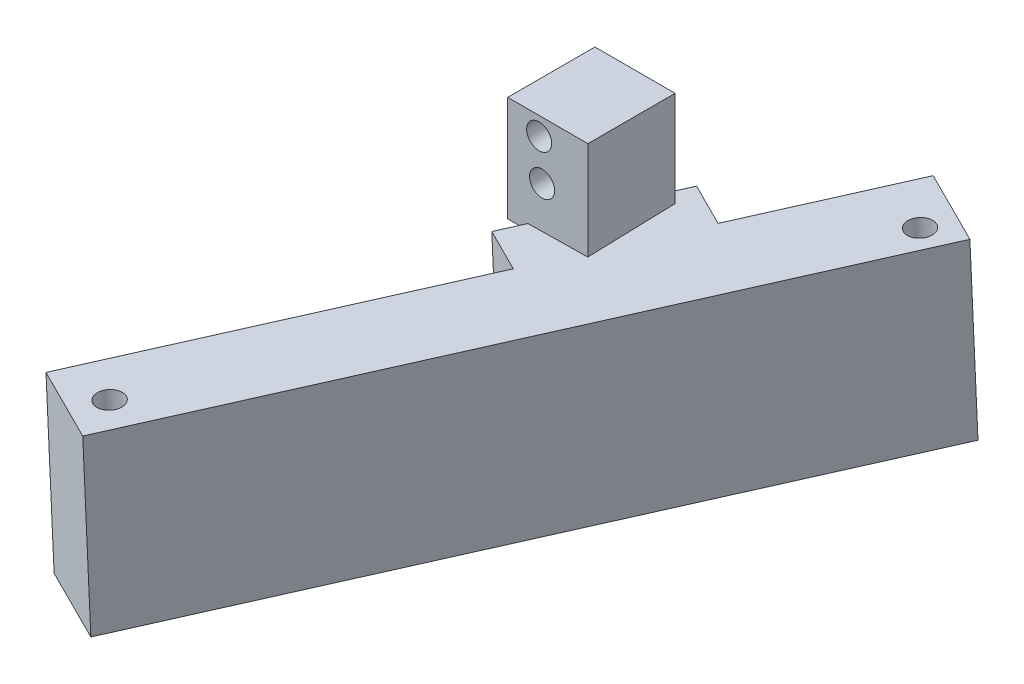
ISO-10303-21;
HEADER;
FILE_DESCRIPTION(('STEP AP214'),'2;1');
FILE_NAME('part.step','',(''),(''),'','','');
FILE_SCHEMA(('AUTOMOTIVE_DESIGN { 1 0 10303 214 1 1 1 1 }'));
ENDSEC;
DATA;
#1=APPLICATION_CONTEXT('core data for automotive mechanical design processes');
#2=APPLICATION_PROTOCOL_DEFINITION('international standard','automotive_design',2000,#1);
#3=PRODUCT_CONTEXT('',#1,'mechanical');
#4=PRODUCT('Part','Part','',(#3));
#5=PRODUCT_RELATED_PRODUCT_CATEGORY('part','',(#4));
#6=PRODUCT_DEFINITION_FORMATION('','',#4);
#7=PRODUCT_DEFINITION_CONTEXT('part definition',#1,'design');
#8=PRODUCT_DEFINITION('design','',#6,#7);
#9=PRODUCT_DEFINITION_SHAPE('','',#8);
#10=(LENGTH_UNIT() NAMED_UNIT(*) SI_UNIT(.MILLI.,.METRE.));
#11=(NAMED_UNIT(*) PLANE_ANGLE_UNIT() SI_UNIT($,.RADIAN.));
#12=(NAMED_UNIT(*) SI_UNIT($,.STERADIAN.) SOLID_ANGLE_UNIT());
#13=UNCERTAINTY_MEASURE_WITH_UNIT(LENGTH_MEASURE(1.E-05),#10,'distance_accuracy_value','');
#14=(GEOMETRIC_REPRESENTATION_CONTEXT(3) GLOBAL_UNCERTAINTY_ASSIGNED_CONTEXT((#13)) GLOBAL_UNIT_ASSIGNED_CONTEXT((#10,
#11,#12)) REPRESENTATION_CONTEXT('',''));
#15=CARTESIAN_POINT('',(0.,0.,0.));
#16=DIRECTION('',(0.,0.,1.));
#17=DIRECTION('',(1.,0.,0.));
#18=AXIS2_PLACEMENT_3D('',#15,#16,#17);
#19=CARTESIAN_POINT('',(-174.016953244847,212.848814703758,-54.6258711261587));
#20=DIRECTION('',(-1.,0.,0.));
#21=DIRECTION('',(0.,-1.,0.));
#22=AXIS2_PLACEMENT_3D('',#19,#20,#21);
#23=PLANE('',#22);
#24=DIRECTION('',(0.,0.0303994474954899,-0.999537829995428));
#25=VECTOR('',#24,1.);
#26=CARTESIAN_POINT('',(-174.016953244847,213.183117490544,6.48364553356453));
#27=LINE('',#26,#25);
#28=CARTESIAN_POINT('',(-174.016953244847,213.380307867998,0.));
#29=VERTEX_POINT('',#28);
#30=CARTESIAN_POINT('',(-174.016953244847,214.052385472863,-22.0979999999997));
#31=VERTEX_POINT('',#30);
#32=EDGE_CURVE('E254',#29,#31,#27,.T.);
#33=ORIENTED_EDGE('',*,*,#32,.T.);
#34=DIRECTION('',(0.,-1.,0.));
#35=VECTOR('',#34,1.);
#36=CARTESIAN_POINT('',(-174.016953244847,212.848814703758,-22.0979999999997));
#37=LINE('',#36,#35);
#38=CARTESIAN_POINT('',(-174.016953244847,238.248814703758,-22.0979999999997));
#39=VERTEX_POINT('',#38);
#40=EDGE_CURVE('E393',#39,#31,#37,.T.);
#41=ORIENTED_EDGE('',*,*,#40,.F.);
#42=DIRECTION('',(0.,0.,1.));
#43=VECTOR('',#42,1.);
#44=CARTESIAN_POINT('',(-174.016953244847,238.248814703758,-54.6258711261587));
#45=LINE('',#44,#43);
#46=CARTESIAN_POINT('',(-174.016953244847,238.248814703758,0.));
#47=VERTEX_POINT('',#46);
#48=EDGE_CURVE('E403',#39,#47,#45,.T.);
#49=ORIENTED_EDGE('',*,*,#48,.T.);
#50=DIRECTION('',(0.,1.,0.));
#51=VECTOR('',#50,1.);
#52=CARTESIAN_POINT('',(-174.016953244847,212.848814703758,0.));
#53=LINE('',#52,#51);
#54=EDGE_CURVE('E389',#29,#47,#53,.T.);
#55=ORIENTED_EDGE('',*,*,#54,.F.);
#56=EDGE_LOOP('',(#33,#41,#49,#55));
#57=FACE_BOUND('',#56,.T.);
#58=ADVANCED_FACE('F125',(#57),#23,.F.);
#59=CARTESIAN_POINT('',(0.,0.,0.));
#60=DIRECTION('',(0.,0.,-1.));
#61=DIRECTION('',(1.,0.,0.));
#62=AXIS2_PLACEMENT_3D('',#59,#60,#61);
#63=PLANE('',#62);
#64=CARTESIAN_POINT('',(-185.628460018152,223.67720196977,0.));
#65=DIRECTION('',(0.,0.,1.));
#66=DIRECTION('',(1.,0.,0.));
#67=AXIS2_PLACEMENT_3D('',#64,#65,#66);
#68=CIRCLE('',#67,3.175);
#69=CARTESIAN_POINT('',(-182.453460018152,223.67720196977,0.));
#70=VERTEX_POINT('',#69);
#71=EDGE_CURVE('E407',#70,#70,#68,.T.);
#72=ORIENTED_EDGE('',*,*,#71,.F.);
#73=EDGE_LOOP('',(#72));
#74=FACE_BOUND('',#73,.T.);
#75=CARTESIAN_POINT('',(-186.372442080017,233.67720196977,0.));
#76=DIRECTION('',(0.,0.,1.));
#77=DIRECTION('',(1.,0.,0.));
#78=AXIS2_PLACEMENT_3D('',#75,#76,#77);
#79=CIRCLE('',#78,3.17500000000006);
#80=CARTESIAN_POINT('',(-183.197442080017,233.67720196977,0.));
#81=VERTEX_POINT('',#80);
#82=EDGE_CURVE('E388',#81,#81,#79,.T.);
#83=ORIENTED_EDGE('',*,*,#82,.F.);
#84=EDGE_LOOP('',(#83));
#85=FACE_BOUND('',#84,.T.);
#86=DIRECTION('',(-0.0157631300254411,0.999875754147385,0.));
#87=VECTOR('',#86,1.);
#88=CARTESIAN_POINT('',(-173.330235036471,168.953350496691,0.));
#89=LINE('',#88,#87);
#90=CARTESIAN_POINT('',(-174.016953244847,212.512775901325,0.));
#91=VERTEX_POINT('',#90);
#92=CARTESIAN_POINT('',(-174.030626561832,213.380092107552,0.));
#93=VERTEX_POINT('',#92);
#94=EDGE_CURVE('E259',#91,#93,#89,.T.);
#95=ORIENTED_EDGE('',*,*,#94,.T.);
#96=DIRECTION('',(0.999875524233858,0.0157777069965299,0.));
#97=VECTOR('',#96,1.);
#98=CARTESIAN_POINT('',(-3.40955200068403,216.07243656105,0.));
#99=LINE('',#98,#97);
#100=EDGE_CURVE('E248',#93,#29,#99,.T.);
#101=ORIENTED_EDGE('',*,*,#100,.T.);
#102=ORIENTED_EDGE('',*,*,#54,.T.);
#103=DIRECTION('',(-1.,0.,0.));
#104=VECTOR('',#103,1.);
#105=CARTESIAN_POINT('',(-174.016953244847,238.248814703758,0.));
#106=LINE('',#105,#104);
#107=CARTESIAN_POINT('',(-194.336953244847,238.248814703758,0.));
#108=VERTEX_POINT('',#107);
#109=EDGE_CURVE('E398',#47,#108,#106,.T.);
#110=ORIENTED_EDGE('',*,*,#109,.T.);
#111=DIRECTION('',(0.,-1.,0.));
#112=VECTOR('',#111,1.);
#113=CARTESIAN_POINT('',(-194.336953244847,238.248814703758,0.));
#114=LINE('',#113,#112);
#115=CARTESIAN_POINT('',(-194.336953244847,211.578814703758,0.));
#116=VERTEX_POINT('',#115);
#117=EDGE_CURVE('E394',#108,#116,#114,.T.);
#118=ORIENTED_EDGE('',*,*,#117,.T.);
#119=DIRECTION('',(-1.,0.,0.));
#120=VECTOR('',#119,1.);
#121=CARTESIAN_POINT('',(-174.016953244847,211.578814703758,0.));
#122=LINE('',#121,#120);
#123=CARTESIAN_POINT('',(-189.188444901988,211.578814703758,0.));
#124=VERTEX_POINT('',#123);
#125=EDGE_CURVE('E302',#124,#116,#122,.T.);
#126=ORIENTED_EDGE('',*,*,#125,.F.);
#127=DIRECTION('',(0.000563474450897646,-0.999999841248259,0.));
#128=VECTOR('',#127,1.);
#129=CARTESIAN_POINT('',(-189.060877118614,-14.8161228482856,0.));
#130=LINE('',#129,#128);
#131=CARTESIAN_POINT('',(-189.188836265412,212.273368576049,5.48606299277665E-13));
#132=VERTEX_POINT('',#131);
#133=EDGE_CURVE('E144',#132,#124,#130,.T.);
#134=ORIENTED_EDGE('',*,*,#133,.F.);
#135=DIRECTION('',(0.999875524233858,0.0157777069965281,0.));
#136=VECTOR('',#135,1.);
#137=CARTESIAN_POINT('',(-3.39586603928595,215.205120554347,0.));
#138=LINE('',#137,#136);
#139=EDGE_CURVE('E134',#132,#91,#138,.T.);
#140=ORIENTED_EDGE('',*,*,#139,.T.);
#141=EDGE_LOOP('',(#95,#101,#102,#110,#118,#126,#134,#140));
#142=FACE_BOUND('',#141,.T.);
#143=ADVANCED_FACE('F271',(#74,#85,#142),#63,.F.);
#144=CARTESIAN_POINT('',(-216.877505131563,216.581396830597,-22.0979999999997));
#145=DIRECTION('',(0.,0.,1.));
#146=DIRECTION('',(-0.999875524233858,-0.0157777069965276,0.));
#147=AXIS2_PLACEMENT_3D('',#144,#145,#146);
#148=PLANE('',#147);
#149=CARTESIAN_POINT('',(-186.372442080017,233.67720196977,-22.0979999999997));
#150=DIRECTION('',(0.,0.,-1.));
#151=DIRECTION('',(0.,1.,0.));
#152=AXIS2_PLACEMENT_3D('',#149,#150,#151);
#153=CIRCLE('',#152,3.17500000000006);
#154=CARTESIAN_POINT('',(-186.372442080017,236.85220196977,-22.0979999999997));
#155=VERTEX_POINT('',#154);
#156=EDGE_CURVE('E424',#155,#155,#153,.T.);
#157=ORIENTED_EDGE('',*,*,#156,.F.);
#158=EDGE_LOOP('',(#157));
#159=FACE_BOUND('',#158,.T.);
#160=CARTESIAN_POINT('',(-185.628460018152,223.67720196977,-22.0979999999997));
#161=DIRECTION('',(0.,0.,-1.));
#162=DIRECTION('',(0.,1.,0.));
#163=AXIS2_PLACEMENT_3D('',#160,#161,#162);
#164=CIRCLE('',#163,3.175);
#165=CARTESIAN_POINT('',(-185.628460018152,226.85220196977,-22.0979999999997));
#166=VERTEX_POINT('',#165);
#167=EDGE_CURVE('E392',#166,#166,#164,.T.);
#168=ORIENTED_EDGE('',*,*,#167,.F.);
#169=EDGE_LOOP('',(#168));
#170=FACE_BOUND('',#169,.T.);
#171=DIRECTION('',(-0.999875524233858,-0.0157777069965299,0.));
#172=VECTOR('',#171,1.);
#173=CARTESIAN_POINT('',(-3.42015452429097,216.744346861578,-22.0979999999997));
#174=LINE('',#173,#172);
#175=CARTESIAN_POINT('',(-178.133939645701,213.987420781192,-22.0979999999997));
#176=VERTEX_POINT('',#175);
#177=EDGE_CURVE('E283',#31,#176,#174,.T.);
#178=ORIENTED_EDGE('',*,*,#177,.T.);
#179=DIRECTION('',(-0.000563474450897648,0.999999841248259,0.));
#180=VECTOR('',#179,1.);
#181=CARTESIAN_POINT('',(-178.135413585915,216.603227012823,-22.0979999999997));
#182=LINE('',#181,#180);
#183=CARTESIAN_POINT('',(-178.133298070165,212.848814703758,-22.0979999999997));
#184=VERTEX_POINT('',#183);
#185=EDGE_CURVE('E428',#184,#176,#182,.T.);
#186=ORIENTED_EDGE('',*,*,#185,.F.);
#187=DIRECTION('',(0.,1.,0.));
#188=VECTOR('',#187,1.);
#189=CARTESIAN_POINT('',(-178.133298070165,211.578814703758,-22.0979999999997));
#190=LINE('',#189,#188);
#191=CARTESIAN_POINT('',(-178.133298070165,211.578814703758,-22.0979999999997));
#192=VERTEX_POINT('',#191);
#193=EDGE_CURVE('E313',#192,#184,#190,.T.);
#194=ORIENTED_EDGE('',*,*,#193,.F.);
#195=DIRECTION('',(1.,0.,0.));
#196=VECTOR('',#195,1.);
#197=CARTESIAN_POINT('',(-194.336953244847,211.578814703758,-22.0979999999997));
#198=LINE('',#197,#196);
#199=CARTESIAN_POINT('',(-194.336953244847,211.578814703758,-22.0979999999997));
#200=VERTEX_POINT('',#199);
#201=EDGE_CURVE('E310',#200,#192,#198,.T.);
#202=ORIENTED_EDGE('',*,*,#201,.F.);
#203=DIRECTION('',(0.,1.,0.));
#204=VECTOR('',#203,1.);
#205=CARTESIAN_POINT('',(-194.336953244847,238.248814703758,-22.0979999999997));
#206=LINE('',#205,#204);
#207=CARTESIAN_POINT('',(-194.336953244847,238.248814703758,-22.0979999999997));
#208=VERTEX_POINT('',#207);
#209=EDGE_CURVE('E402',#200,#208,#206,.T.);
#210=ORIENTED_EDGE('',*,*,#209,.T.);
#211=DIRECTION('',(1.,0.,0.));
#212=VECTOR('',#211,1.);
#213=CARTESIAN_POINT('',(-174.016953244847,238.248814703758,-22.0979999999997));
#214=LINE('',#213,#212);
#215=EDGE_CURVE('E411',#208,#39,#214,.T.);
#216=ORIENTED_EDGE('',*,*,#215,.T.);
#217=ORIENTED_EDGE('',*,*,#40,.T.);
#218=EDGE_LOOP('',(#178,#186,#194,#202,#210,#216,#217));
#219=FACE_BOUND('',#218,.T.);
#220=ADVANCED_FACE('F127',(#159,#170,#219),#148,.F.);
#221=CARTESIAN_POINT('',(-171.33334940986,-14.8061338377583,-35.4330594880956));
#222=DIRECTION('',(-0.894315959358025,-0.000503924274127121,-0.447435705881706));
#223=DIRECTION('',(0.447435762692556,0.,-0.894316072909199));
#224=AXIS2_PLACEMENT_3D('',#221,#222,#223);
#225=PLANE('',#224);
#226=DIRECTION('',(0.447435762692556,0.,-0.894316072909199));
#227=VECTOR('',#226,1.);
#228=CARTESIAN_POINT('',(-171.435373779242,211.578814703758,-35.4841033560417));
#229=LINE('',#228,#227);
#230=CARTESIAN_POINT('',(-181.673124971977,211.578814703758,-15.0213102457833));
#231=VERTEX_POINT('',#230);
#232=EDGE_CURVE('E12',#124,#231,#229,.T.);
#233=ORIENTED_EDGE('',*,*,#232,.T.);
#234=DIRECTION('',(-0.00044735109258037,0.999999873002685,-0.000232102595376401));
#235=VECTOR('',#234,1.);
#236=CARTESIAN_POINT('',(-181.571851480918,-14.8059642271342,-14.9687657443667));
#237=LINE('',#236,#235);
#238=CARTESIAN_POINT('',(-181.673693107937,212.848814703758,-15.0216050161169));
#239=VERTEX_POINT('',#238);
#240=EDGE_CURVE('E323',#231,#239,#237,.T.);
#241=ORIENTED_EDGE('',*,*,#240,.T.);
#242=DIRECTION('',(0.447435762692556,0.,-0.894316072909199));
#243=VECTOR('',#242,1.);
#244=CARTESIAN_POINT('',(-168.361254858103,212.848814703758,-41.6299552847527));
#245=LINE('',#244,#243);
#246=EDGE_CURVE('E331',#239,#184,#245,.T.);
#247=ORIENTED_EDGE('',*,*,#246,.T.);
#248=ORIENTED_EDGE('',*,*,#185,.T.);
#249=DIRECTION('',(0.447157979679014,0.0342395776762373,-0.89379941403535));
#250=VECTOR('',#249,1.);
#251=CARTESIAN_POINT('',(-178.147124134856,213.986411224478,-22.0716462520701));
#252=LINE('',#251,#250);
#253=CARTESIAN_POINT('',(-174.947486578378,214.231412417858,-28.4672252265498));
#254=VERTEX_POINT('',#253);
#255=EDGE_CURVE('E287',#176,#254,#252,.T.);
#256=ORIENTED_EDGE('',*,*,#255,.T.);
#257=DIRECTION('',(-0.0157704168275924,0.999413526714982,0.0303956669972092));
#258=VECTOR('',#257,1.);
#259=CARTESIAN_POINT('',(-171.33334940986,-14.8061338377583,-35.4330594880956));
#260=LINE('',#259,#258);
#261=CARTESIAN_POINT('',(-174.246491550392,169.807481155377,-29.8183126245757));
#262=VERTEX_POINT('',#261);
#263=EDGE_CURVE('E340',#262,#254,#260,.T.);
#264=ORIENTED_EDGE('',*,*,#263,.F.);
#265=DIRECTION('',(0.447157979679015,0.0342395776762387,-0.893799414035349));
#266=VECTOR('',#265,1.);
#267=CARTESIAN_POINT('',(-174.246491550392,169.807481155377,-29.8183126245757));
#268=LINE('',#267,#266);
#269=CARTESIAN_POINT('',(-191.550880034104,168.482457381781,4.77047476122655));
#270=VERTEX_POINT('',#269);
#271=EDGE_CURVE('E365',#270,#262,#268,.T.);
#272=ORIENTED_EDGE('',*,*,#271,.F.);
#273=DIRECTION('',(-0.0157704168275924,0.999413526714982,0.0303956669972092));
#274=VECTOR('',#273,1.);
#275=CARTESIAN_POINT('',(-188.637737893573,-16.1311576113544,-0.844272102293387));
#276=LINE('',#275,#274);
#277=CARTESIAN_POINT('',(-192.251875062091,212.906388644262,6.1215621592525));
#278=VERTEX_POINT('',#277);
#279=EDGE_CURVE('E336',#270,#278,#276,.T.);
#280=ORIENTED_EDGE('',*,*,#279,.T.);
#281=DIRECTION('',(0.447157979679018,0.034239577676239,-0.893799414035348));
#282=VECTOR('',#281,1.);
#283=CARTESIAN_POINT('',(-192.251875062091,212.906388644262,6.1215621592525));
#284=LINE('',#283,#282);
#285=CARTESIAN_POINT('',(-189.202509582397,213.139883272447,0.0263537479295688));
#286=VERTEX_POINT('',#285);
#287=EDGE_CURVE('E461',#278,#286,#284,.T.);
#288=ORIENTED_EDGE('',*,*,#287,.T.);
#289=DIRECTION('',(-0.0157704168275923,0.999413526714982,0.0303956669972092));
#290=VECTOR('',#289,1.);
#291=CARTESIAN_POINT('',(-188.501483013577,168.713953182913,-1.32479444143038));
#292=LINE('',#291,#290);
#293=EDGE_CURVE('E273',#132,#286,#292,.T.);
#294=ORIENTED_EDGE('',*,*,#293,.F.);
#295=ORIENTED_EDGE('',*,*,#133,.T.);
#296=EDGE_LOOP('',(#233,#241,#247,#248,#256,#264,#272,#280,#288,#294,#295));
#297=FACE_BOUND('',#296,.T.);
#298=ADVANCED_FACE('F510',(#297),#225,.T.);
#299=CARTESIAN_POINT('',(-174.016953244847,238.248814703758,-54.6258711261587));
#300=DIRECTION('',(0.,-1.,0.));
#301=DIRECTION('',(0.,0.,1.));
#302=AXIS2_PLACEMENT_3D('',#299,#300,#301);
#303=PLANE('',#302);
#304=DIRECTION('',(0.,0.,1.));
#305=VECTOR('',#304,1.);
#306=CARTESIAN_POINT('',(-194.336953244847,238.248814703758,-54.6258711261587));
#307=LINE('',#306,#305);
#308=EDGE_CURVE('E397',#208,#108,#307,.T.);
#309=ORIENTED_EDGE('',*,*,#308,.T.);
#310=ORIENTED_EDGE('',*,*,#109,.F.);
#311=ORIENTED_EDGE('',*,*,#48,.F.);
#312=ORIENTED_EDGE('',*,*,#215,.F.);
#313=EDGE_LOOP('',(#309,#310,#311,#312));
#314=FACE_BOUND('',#313,.T.);
#315=ADVANCED_FACE('F506',(#314),#303,.F.);
#316=CARTESIAN_POINT('',(-194.336953244847,238.248814703758,-54.6258711261587));
#317=DIRECTION('',(1.,0.,0.));
#318=DIRECTION('',(0.,0.,1.));
#319=AXIS2_PLACEMENT_3D('',#316,#317,#318);
#320=PLANE('',#319);
#321=ORIENTED_EDGE('',*,*,#209,.F.);
#322=DIRECTION('',(0.,0.,-1.));
#323=VECTOR('',#322,1.);
#324=CARTESIAN_POINT('',(-194.336953244847,211.578814703758,0.));
#325=LINE('',#324,#323);
#326=EDGE_CURVE('E306',#116,#200,#325,.T.);
#327=ORIENTED_EDGE('',*,*,#326,.F.);
#328=ORIENTED_EDGE('',*,*,#117,.F.);
#329=ORIENTED_EDGE('',*,*,#308,.F.);
#330=EDGE_LOOP('',(#321,#327,#328,#329));
#331=FACE_BOUND('',#330,.T.);
#332=ADVANCED_FACE('F502',(#331),#320,.F.);
#333=CARTESIAN_POINT('',(-186.372442080017,233.67720196977,-54.6258711261587));
#334=DIRECTION('',(0.,0.,1.));
#335=DIRECTION('',(-1.,0.,0.));
#336=AXIS2_PLACEMENT_3D('',#333,#334,#335);
#337=CYLINDRICAL_SURFACE('',#336,3.17500000000006);
#338=ORIENTED_EDGE('',*,*,#156,.T.);
#339=EDGE_LOOP('',(#338));
#340=FACE_BOUND('',#339,.T.);
#341=ORIENTED_EDGE('',*,*,#82,.T.);
#342=EDGE_LOOP('',(#341));
#343=FACE_BOUND('',#342,.T.);
#344=ADVANCED_FACE('F505',(#340,#343),#337,.F.);
#345=CARTESIAN_POINT('',(-185.628460018152,223.67720196977,-54.6258711261587));
#346=DIRECTION('',(0.,0.,1.));
#347=DIRECTION('',(-1.,0.,0.));
#348=AXIS2_PLACEMENT_3D('',#345,#346,#347);
#349=CYLINDRICAL_SURFACE('',#348,3.175);
#350=ORIENTED_EDGE('',*,*,#167,.T.);
#351=EDGE_LOOP('',(#350));
#352=FACE_BOUND('',#351,.T.);
#353=ORIENTED_EDGE('',*,*,#71,.T.);
#354=EDGE_LOOP('',(#353));
#355=FACE_BOUND('',#354,.T.);
#356=ADVANCED_FACE('F513',(#352,#355),#349,.F.);
#357=CARTESIAN_POINT('',(-177.733197664702,-16.1250131805612,4.61138437298949));
#358=DIRECTION('',(-0.894315959358026,-0.00050392427412718,-0.447435705881705));
#359=DIRECTION('',(0.447435762692554,0.,-0.8943160729092));
#360=AXIS2_PLACEMENT_3D('',#357,#358,#359);
#361=PLANE('',#360);
#362=DIRECTION('',(-0.0157704168275924,0.999413526714982,0.0303956669972092));
#363=VECTOR('',#362,1.);
#364=CARTESIAN_POINT('',(-217.216804379115,-19.148333976506,83.5329873614397));
#365=LINE('',#364,#363);
#366=CARTESIAN_POINT('',(-220.129946519646,165.46528101663,89.1477342249596));
#367=VERTEX_POINT('',#366);
#368=CARTESIAN_POINT('',(-220.830941547632,209.889212279111,90.4988216229856));
#369=VERTEX_POINT('',#368);
#370=EDGE_CURVE('E348',#367,#369,#365,.T.);
#371=ORIENTED_EDGE('',*,*,#370,.T.);
#372=DIRECTION('',(0.447157979679013,0.034239577676239,-0.893799414035351));
#373=VECTOR('',#372,1.);
#374=CARTESIAN_POINT('',(-220.830941547632,209.889212279111,90.4988216229856));
#375=LINE('',#374,#373);
#376=CARTESIAN_POINT('',(-181.347334833219,212.912533075055,11.5772186345354));
#377=VERTEX_POINT('',#376);
#378=EDGE_CURVE('E453',#369,#377,#375,.T.);
#379=ORIENTED_EDGE('',*,*,#378,.T.);
#380=DIRECTION('',(-0.0157704168275924,0.999413526714982,0.0303956669972092));
#381=VECTOR('',#380,1.);
#382=CARTESIAN_POINT('',(-177.733197664702,-16.1250131805612,4.61138437298949));
#383=LINE('',#382,#381);
#384=CARTESIAN_POINT('',(-180.646339805233,168.488601812574,10.2261312365094));
#385=VERTEX_POINT('',#384);
#386=EDGE_CURVE('E344',#385,#377,#383,.T.);
#387=ORIENTED_EDGE('',*,*,#386,.F.);
#388=DIRECTION('',(0.447157979679014,0.0342395776762387,-0.89379941403535));
#389=VECTOR('',#388,1.);
#390=CARTESIAN_POINT('',(-180.646339805233,168.488601812574,10.2261312365094));
#391=LINE('',#390,#389);
#392=EDGE_CURVE('E326',#367,#385,#391,.T.);
#393=ORIENTED_EDGE('',*,*,#392,.F.);
#394=EDGE_LOOP('',(#371,#379,#387,#393));
#395=FACE_BOUND('',#394,.T.);
#396=ADVANCED_FACE('F516',(#395),#361,.T.);
#397=CARTESIAN_POINT('',(-217.216804379115,-19.148333976506,83.5329873614397));
#398=DIRECTION('',(-0.447157979679013,-0.0342395776762388,0.893799414035351));
#399=DIRECTION('',(-0.894323797431926,0.,-0.447420322903351));
#400=AXIS2_PLACEMENT_3D('',#397,#398,#399);
#401=PLANE('',#400);
#402=DIRECTION('',(-0.0157704168275924,0.999413526714982,0.0303956669972092));
#403=VECTOR('',#402,1.);
#404=CARTESIAN_POINT('',(-198.591031629984,-19.1378388277675,92.8516578943707));
#405=LINE('',#404,#403);
#406=CARTESIAN_POINT('',(-201.504173770515,165.475776165368,98.4664047578906));
#407=VERTEX_POINT('',#406);
#408=CARTESIAN_POINT('',(-202.205168798502,209.899707427849,99.8174921559166));
#409=VERTEX_POINT('',#408);
#410=EDGE_CURVE('E352',#407,#409,#405,.T.);
#411=ORIENTED_EDGE('',*,*,#410,.T.);
#412=DIRECTION('',(-0.894315959358027,-0.000503924274127552,-0.447435705881704));
#413=VECTOR('',#412,1.);
#414=CARTESIAN_POINT('',(-202.205168798502,209.899707427849,99.8174921559166));
#415=LINE('',#414,#413);
#416=EDGE_CURVE('E449',#409,#369,#415,.T.);
#417=ORIENTED_EDGE('',*,*,#416,.T.);
#418=ORIENTED_EDGE('',*,*,#370,.F.);
#419=DIRECTION('',(-0.894315959358027,-0.000503924274127118,-0.447435705881704));
#420=VECTOR('',#419,1.);
#421=CARTESIAN_POINT('',(-220.129946519646,165.46528101663,89.1477342249596));
#422=LINE('',#421,#420);
#423=EDGE_CURVE('E345',#407,#367,#422,.T.);
#424=ORIENTED_EDGE('',*,*,#423,.F.);
#425=EDGE_LOOP('',(#411,#417,#418,#424));
#426=FACE_BOUND('',#425,.T.);
#427=ADVANCED_FACE('F522',(#426),#401,.T.);
#428=CARTESIAN_POINT('',(-198.591031629984,-19.1378388277675,92.8516578943707));
#429=DIRECTION('',(0.894315959358026,0.000503924274127189,0.447435705881704));
#430=DIRECTION('',(-0.447435762692554,0.,0.8943160729092));
#431=AXIS2_PLACEMENT_3D('',#428,#429,#430);
#432=PLANE('',#431);
#433=DIRECTION('',(-0.0157704168275924,0.999413526714982,0.0303956669972092));
#434=VECTOR('',#433,1.);
#435=CARTESIAN_POINT('',(-123.629467916594,-13.3979160261228,-56.9848758745154));
#436=LINE('',#435,#434);
#437=CARTESIAN_POINT('',(-126.542610057125,171.215698967013,-51.3701290109955));
#438=VERTEX_POINT('',#437);
#439=CARTESIAN_POINT('',(-127.243605085112,215.639630229494,-50.0190416129695));
#440=VERTEX_POINT('',#439);
#441=EDGE_CURVE('E356',#438,#440,#436,.T.);
#442=ORIENTED_EDGE('',*,*,#441,.T.);
#443=DIRECTION('',(-0.447157979679013,-0.0342395776762386,0.89379941403535));
#444=VECTOR('',#443,1.);
#445=CARTESIAN_POINT('',(-127.243605085112,215.639630229494,-50.0190416129695));
#446=LINE('',#445,#444);
#447=EDGE_CURVE('E445',#440,#409,#446,.T.);
#448=ORIENTED_EDGE('',*,*,#447,.T.);
#449=ORIENTED_EDGE('',*,*,#410,.F.);
#450=DIRECTION('',(-0.447157979679014,-0.0342395776762387,0.89379941403535));
#451=VECTOR('',#450,1.);
#452=CARTESIAN_POINT('',(-201.504173770515,165.475776165368,98.4664047578906));
#453=LINE('',#452,#451);
#454=EDGE_CURVE('E349',#438,#407,#453,.T.);
#455=ORIENTED_EDGE('',*,*,#454,.F.);
#456=EDGE_LOOP('',(#442,#448,#449,#455));
#457=FACE_BOUND('',#456,.T.);
#458=ADVANCED_FACE('F576',(#457),#432,.T.);
#459=CARTESIAN_POINT('',(-123.629467916594,-13.3979160261228,-56.9848758745154));
#460=DIRECTION('',(0.447157979679014,0.0342395776762388,-0.89379941403535));
#461=DIRECTION('',(0.894323797431926,0.,0.447420322903353));
#462=AXIS2_PLACEMENT_3D('',#459,#460,#461);
#463=PLANE('',#462);
#464=DIRECTION('',(-0.0157704168275924,0.999413526714982,0.0303956669972092));
#465=VECTOR('',#464,1.);
#466=CARTESIAN_POINT('',(-142.256280718103,-13.4084117609043,-66.3040667566196));
#467=LINE('',#466,#465);
#468=CARTESIAN_POINT('',(-145.169422858634,171.205203232231,-60.6893198930996));
#469=VERTEX_POINT('',#468);
#470=CARTESIAN_POINT('',(-145.870417886621,215.629134494712,-59.3382324950737));
#471=VERTEX_POINT('',#470);
#472=EDGE_CURVE('E360',#469,#471,#467,.T.);
#473=ORIENTED_EDGE('',*,*,#472,.T.);
#474=DIRECTION('',(0.894315959358026,0.000503924274126784,0.447435705881704));
#475=VECTOR('',#474,1.);
#476=CARTESIAN_POINT('',(-145.870417886621,215.629134494712,-59.3382324950737));
#477=LINE('',#476,#475);
#478=EDGE_CURVE('E441',#471,#440,#477,.T.);
#479=ORIENTED_EDGE('',*,*,#478,.T.);
#480=ORIENTED_EDGE('',*,*,#441,.F.);
#481=DIRECTION('',(0.894315959358026,0.000503924274127069,0.447435705881705));
#482=VECTOR('',#481,1.);
#483=CARTESIAN_POINT('',(-126.542610057125,171.215698967013,-51.3701290109955));
#484=LINE('',#483,#482);
#485=EDGE_CURVE('E353',#469,#438,#484,.T.);
#486=ORIENTED_EDGE('',*,*,#485,.F.);
#487=EDGE_LOOP('',(#473,#479,#480,#486));
#488=FACE_BOUND('',#487,.T.);
#489=ADVANCED_FACE('F572',(#488),#463,.T.);
#490=CARTESIAN_POINT('',(-142.256280718103,-13.4084117609043,-66.3040667566196));
#491=DIRECTION('',(-0.894315959358026,-0.000503924274127185,-0.447435705881704));
#492=DIRECTION('',(0.447435762692554,0.,-0.8943160729092));
#493=AXIS2_PLACEMENT_3D('',#490,#491,#492);
#494=PLANE('',#493);
#495=DIRECTION('',(-0.0157704168275924,0.999413526714982,0.0303956669972092));
#496=VECTOR('',#495,1.);
#497=CARTESIAN_POINT('',(-160.429849233367,-14.7999899930082,-29.9779233619859));
#498=LINE('',#497,#496);
#499=CARTESIAN_POINT('',(-163.342991373899,169.813625000127,-24.363176498466));
#500=VERTEX_POINT('',#499);
#501=CARTESIAN_POINT('',(-164.043986401885,214.237556262608,-23.01208910044));
#502=VERTEX_POINT('',#501);
#503=EDGE_CURVE('E364',#500,#502,#498,.T.);
#504=ORIENTED_EDGE('',*,*,#503,.T.);
#505=DIRECTION('',(0.447157979679014,0.0342395776762385,-0.89379941403535));
#506=VECTOR('',#505,1.);
#507=CARTESIAN_POINT('',(-164.043986401885,214.237556262608,-23.01208910044));
#508=LINE('',#507,#506);
#509=EDGE_CURVE('E437',#502,#471,#508,.T.);
#510=ORIENTED_EDGE('',*,*,#509,.T.);
#511=ORIENTED_EDGE('',*,*,#472,.F.);
#512=DIRECTION('',(0.447157979679014,0.0342395776762387,-0.89379941403535));
#513=VECTOR('',#512,1.);
#514=CARTESIAN_POINT('',(-145.169422858634,171.205203232231,-60.6893198930996));
#515=LINE('',#514,#513);
#516=EDGE_CURVE('E357',#500,#469,#515,.T.);
#517=ORIENTED_EDGE('',*,*,#516,.F.);
#518=EDGE_LOOP('',(#504,#510,#511,#517));
#519=FACE_BOUND('',#518,.T.);
#520=ADVANCED_FACE('F568',(#519),#494,.T.);
#521=CARTESIAN_POINT('',(-160.429849233367,-14.7999899930082,-29.9779233619859));
#522=DIRECTION('',(0.447157979679013,0.0342395776762388,-0.893799414035351));
#523=DIRECTION('',(0.894323797431926,0.,0.447420322903351));
#524=AXIS2_PLACEMENT_3D('',#521,#522,#523);
#525=PLANE('',#524);
#526=ORIENTED_EDGE('',*,*,#263,.T.);
#527=DIRECTION('',(0.894315959358026,0.000503924274128339,0.447435705881704));
#528=VECTOR('',#527,1.);
#529=CARTESIAN_POINT('',(-174.947486578378,214.231412417858,-28.4672252265498));
#530=LINE('',#529,#528);
#531=EDGE_CURVE('E292',#254,#502,#530,.T.);
#532=ORIENTED_EDGE('',*,*,#531,.T.);
#533=ORIENTED_EDGE('',*,*,#503,.F.);
#534=DIRECTION('',(0.894315959358027,0.000503924274127121,0.447435705881704));
#535=VECTOR('',#534,1.);
#536=CARTESIAN_POINT('',(-163.342991373899,169.813625000127,-24.363176498466));
#537=LINE('',#536,#535);
#538=EDGE_CURVE('E361',#262,#500,#537,.T.);
#539=ORIENTED_EDGE('',*,*,#538,.F.);
#540=EDGE_LOOP('',(#526,#532,#533,#539));
#541=FACE_BOUND('',#540,.T.);
#542=ADVANCED_FACE('F487',(#541),#525,.T.);
#543=CARTESIAN_POINT('',(-188.637737893573,-16.1311576113544,-0.844272102293387));
#544=DIRECTION('',(-0.447157979679015,-0.0342395776762388,0.89379941403535));
#545=DIRECTION('',(-0.894323797431925,0.,-0.447420322903354));
#546=AXIS2_PLACEMENT_3D('',#543,#544,#545);
#547=PLANE('',#546);
#548=ORIENTED_EDGE('',*,*,#386,.T.);
#549=DIRECTION('',(-0.894315959358025,-0.000503924274127026,-0.447435705881708));
#550=VECTOR('',#549,1.);
#551=CARTESIAN_POINT('',(-181.347334833219,212.912533075055,11.5772186345354));
#552=LINE('',#551,#550);
#553=EDGE_CURVE('E457',#377,#278,#552,.T.);
#554=ORIENTED_EDGE('',*,*,#553,.T.);
#555=ORIENTED_EDGE('',*,*,#279,.F.);
#556=DIRECTION('',(-0.894315959358025,-0.000503924274127035,-0.447435705881706));
#557=VECTOR('',#556,1.);
#558=CARTESIAN_POINT('',(-191.550880034104,168.482457381781,4.77047476122656));
#559=LINE('',#558,#557);
#560=EDGE_CURVE('E337',#385,#270,#559,.T.);
#561=ORIENTED_EDGE('',*,*,#560,.F.);
#562=EDGE_LOOP('',(#548,#554,#555,#561));
#563=FACE_BOUND('',#562,.T.);
#564=ADVANCED_FACE('F477',(#563),#547,.T.);
#565=CARTESIAN_POINT('',(-132.709969529216,-13.6497621885126,-53.4154471819686));
#566=DIRECTION('',(-0.0157704168275924,0.999413526714982,0.0303956669972092));
#567=DIRECTION('',(0.,0.0303994474954896,-0.999537829995428));
#568=AXIS2_PLACEMENT_3D('',#565,#566,#567);
#569=CYLINDRICAL_SURFACE('',#568,3.17499999999999);
#570=CARTESIAN_POINT('',(-135.623111669747,170.963852804623,-47.8007003184487));
#571=DIRECTION('',(-0.0157704168275923,0.999413526714982,0.0303956669972092));
#572=DIRECTION('',(0.,-0.0303994474954895,0.999537829995428));
#573=AXIS2_PLACEMENT_3D('',#570,#571,#572);
#574=CIRCLE('',#573,3.17499999999999);
#575=CARTESIAN_POINT('',(-135.623111669747,170.867334558825,-44.6271677082132));
#576=VERTEX_POINT('',#575);
#577=EDGE_CURVE('E327',#576,#576,#574,.F.);
#578=ORIENTED_EDGE('',*,*,#577,.T.);
#579=EDGE_LOOP('',(#578));
#580=FACE_BOUND('',#579,.T.);
#581=CARTESIAN_POINT('',(-136.324106697734,215.387784067104,-46.4496129204228));
#582=DIRECTION('',(0.0157704168275923,-0.999413526714982,-0.0303956669972092));
#583=DIRECTION('',(0.,0.0303994474954895,-0.999537829995428));
#584=AXIS2_PLACEMENT_3D('',#581,#582,#583);
#585=CIRCLE('',#584,3.17500000000002);
#586=CARTESIAN_POINT('',(-136.324106697734,215.484302312902,-49.6231455306583));
#587=VERTEX_POINT('',#586);
#588=EDGE_CURVE('E278',#587,#587,#585,.T.);
#589=ORIENTED_EDGE('',*,*,#588,.F.);
#590=EDGE_LOOP('',(#589));
#591=FACE_BOUND('',#590,.T.);
#592=ADVANCED_FACE('F474',(#580,#591),#569,.F.);
#593=CARTESIAN_POINT('',(-202.855165444124,-18.86843893718,81.7813608537693));
#594=DIRECTION('',(-0.0157704168275924,0.999413526714982,0.0303956669972092));
#595=DIRECTION('',(0.,0.0303994474954896,-0.999537829995428));
#596=AXIS2_PLACEMENT_3D('',#593,#594,#595);
#597=CYLINDRICAL_SURFACE('',#596,3.17499999999999);
#598=CARTESIAN_POINT('',(-205.768307584655,165.745176055956,87.3961077172892));
#599=DIRECTION('',(-0.0157704168275923,0.999413526714982,0.0303956669972092));
#600=DIRECTION('',(0.,-0.0303994474954895,0.999537829995428));
#601=AXIS2_PLACEMENT_3D('',#598,#599,#600);
#602=CIRCLE('',#601,3.17499999999999);
#603=CARTESIAN_POINT('',(-205.768307584655,165.648657810157,90.5696403275247));
#604=VERTEX_POINT('',#603);
#605=EDGE_CURVE('E332',#604,#604,#602,.F.);
#606=ORIENTED_EDGE('',*,*,#605,.T.);
#607=EDGE_LOOP('',(#606));
#608=FACE_BOUND('',#607,.T.);
#609=CARTESIAN_POINT('',(-206.469302612642,210.169107318437,88.7471951153152));
#610=DIRECTION('',(0.0157704168275923,-0.999413526714982,-0.0303956669972092));
#611=DIRECTION('',(0.,0.0303994474954895,-0.999537829995428));
#612=AXIS2_PLACEMENT_3D('',#609,#610,#611);
#613=CIRCLE('',#612,3.17499999999999);
#614=CARTESIAN_POINT('',(-206.469302612642,210.265625564235,85.5736625050797));
#615=VERTEX_POINT('',#614);
#616=EDGE_CURVE('E268',#615,#615,#613,.T.);
#617=ORIENTED_EDGE('',*,*,#616,.F.);
#618=EDGE_LOOP('',(#617));
#619=FACE_BOUND('',#618,.T.);
#620=ADVANCED_FACE('F476',(#608,#619),#597,.F.);
#621=CARTESIAN_POINT('',(-135.623111669747,170.963852804623,-47.8007003184485));
#622=DIRECTION('',(0.0157704168275923,-0.999413526714982,-0.0303956669972092));
#623=DIRECTION('',(0.100164718838687,-0.0286674208627036,0.994557795244222));
#624=AXIS2_PLACEMENT_3D('',#621,#622,#623);
#625=PLANE('',#624);
#626=ORIENTED_EDGE('',*,*,#392,.T.);
#627=ORIENTED_EDGE('',*,*,#560,.T.);
#628=ORIENTED_EDGE('',*,*,#271,.T.);
#629=ORIENTED_EDGE('',*,*,#538,.T.);
#630=ORIENTED_EDGE('',*,*,#516,.T.);
#631=ORIENTED_EDGE('',*,*,#485,.T.);
#632=ORIENTED_EDGE('',*,*,#454,.T.);
#633=ORIENTED_EDGE('',*,*,#423,.T.);
#634=EDGE_LOOP('',(#626,#627,#628,#629,#630,#631,#632,#633));
#635=FACE_BOUND('',#634,.T.);
#636=ORIENTED_EDGE('',*,*,#605,.F.);
#637=EDGE_LOOP('',(#636));
#638=FACE_BOUND('',#637,.T.);
#639=ORIENTED_EDGE('',*,*,#577,.F.);
#640=EDGE_LOOP('',(#639));
#641=FACE_BOUND('',#640,.T.);
#642=ADVANCED_FACE('F484',(#635,#638,#641),#625,.T.);
#643=CARTESIAN_POINT('',(-178.133298070165,211.578814703758,-22.0979999999997));
#644=DIRECTION('',(-0.894316072909198,0.,-0.447435762692557));
#645=DIRECTION('',(-0.447435762692557,0.,0.894316072909198));
#646=AXIS2_PLACEMENT_3D('',#643,#644,#645);
#647=PLANE('',#646);
#648=ORIENTED_EDGE('',*,*,#246,.F.);
#649=DIRECTION('',(0.,1.,0.));
#650=VECTOR('',#649,1.);
#651=CARTESIAN_POINT('',(-181.673693107937,211.578814703758,-15.0216050161169));
#652=LINE('',#651,#650);
#653=CARTESIAN_POINT('',(-181.673693107937,211.578814703758,-15.0216050161169));
#654=VERTEX_POINT('',#653);
#655=EDGE_CURVE('E317',#654,#239,#652,.T.);
#656=ORIENTED_EDGE('',*,*,#655,.F.);
#657=DIRECTION('',(-0.447435762692557,0.,0.894316072909198));
#658=VECTOR('',#657,1.);
#659=CARTESIAN_POINT('',(-178.133298070165,211.578814703758,-22.0979999999997));
#660=LINE('',#659,#658);
#661=EDGE_CURVE('E291',#192,#654,#660,.T.);
#662=ORIENTED_EDGE('',*,*,#661,.F.);
#663=ORIENTED_EDGE('',*,*,#193,.T.);
#664=EDGE_LOOP('',(#648,#656,#662,#663));
#665=FACE_BOUND('',#664,.T.);
#666=ADVANCED_FACE('F554',(#665),#647,.F.);
#667=CARTESIAN_POINT('',(-181.673693107937,211.578814703758,-15.0216050161169));
#668=DIRECTION('',(-0.460540409048831,0.,0.887638739371562));
#669=DIRECTION('',(0.887638739371562,0.,0.460540409048831));
#670=AXIS2_PLACEMENT_3D('',#667,#668,#669);
#671=PLANE('',#670);
#672=ORIENTED_EDGE('',*,*,#240,.F.);
#673=DIRECTION('',(0.887638739371562,0.,0.460540409048831));
#674=VECTOR('',#673,1.);
#675=CARTESIAN_POINT('',(-181.673693107937,211.578814703758,-15.0216050161169));
#676=LINE('',#675,#674);
#677=EDGE_CURVE('E298',#654,#231,#676,.T.);
#678=ORIENTED_EDGE('',*,*,#677,.F.);
#679=ORIENTED_EDGE('',*,*,#655,.T.);
#680=EDGE_LOOP('',(#672,#678,#679));
#681=FACE_BOUND('',#680,.T.);
#682=ADVANCED_FACE('F551',(#681),#671,.F.);
#683=CARTESIAN_POINT('',(0.,211.578814703758,0.));
#684=DIRECTION('',(0.,1.,0.));
#685=DIRECTION('',(0.,0.,1.));
#686=AXIS2_PLACEMENT_3D('',#683,#684,#685);
#687=PLANE('',#686);
#688=ORIENTED_EDGE('',*,*,#232,.F.);
#689=ORIENTED_EDGE('',*,*,#125,.T.);
#690=ORIENTED_EDGE('',*,*,#326,.T.);
#691=ORIENTED_EDGE('',*,*,#201,.T.);
#692=ORIENTED_EDGE('',*,*,#661,.T.);
#693=ORIENTED_EDGE('',*,*,#677,.T.);
#694=EDGE_LOOP('',(#688,#689,#690,#691,#692,#693));
#695=FACE_BOUND('',#694,.T.);
#696=ADVANCED_FACE('F546',(#695),#687,.F.);
#697=CARTESIAN_POINT('',(-188.501483013577,168.713953182913,-1.32479444143038));
#698=DIRECTION('',(0.000479573927844767,-0.0303918834732723,0.99953794496647));
#699=DIRECTION('',(0.,-0.999538059908932,-0.0303918869682051));
#700=AXIS2_PLACEMENT_3D('',#697,#698,#699);
#701=PLANE('',#700);
#702=ORIENTED_EDGE('',*,*,#139,.F.);
#703=ORIENTED_EDGE('',*,*,#293,.T.);
#704=DIRECTION('',(0.999875524233858,0.0157777069965268,0.));
#705=VECTOR('',#704,1.);
#706=CARTESIAN_POINT('',(-189.202509582397,213.139883272447,0.0263537479295688));
#707=LINE('',#706,#705);
#708=CARTESIAN_POINT('',(-174.030626561832,213.379290597742,0.026353747929587));
#709=VERTEX_POINT('',#708);
#710=EDGE_CURVE('E267',#286,#709,#707,.T.);
#711=ORIENTED_EDGE('',*,*,#710,.T.);
#712=DIRECTION('',(-0.0157704168275923,0.999413526714982,0.0303956669972092));
#713=VECTOR('',#712,1.);
#714=CARTESIAN_POINT('',(-173.329599993012,168.953360508207,-1.32479444143036));
#715=LINE('',#714,#713);
#716=EDGE_CURVE('E264',#91,#709,#715,.T.);
#717=ORIENTED_EDGE('',*,*,#716,.F.);
#718=EDGE_LOOP('',(#702,#703,#711,#717));
#719=FACE_BOUND('',#718,.T.);
#720=ADVANCED_FACE('F608',(#719),#701,.F.);
#721=CARTESIAN_POINT('',(-173.329599993012,168.953360508207,-1.32479444143036));
#722=DIRECTION('',(0.999875639243743,0.015763128213975,0.000479411958331127));
#723=DIRECTION('',(-0.0157631300254411,0.999875754147385,0.));
#724=AXIS2_PLACEMENT_3D('',#721,#722,#723);
#725=PLANE('',#724);
#726=ORIENTED_EDGE('',*,*,#94,.F.);
#727=ORIENTED_EDGE('',*,*,#716,.T.);
#728=DIRECTION('',(0.,0.0303994474954899,-0.999537829995428));
#729=VECTOR('',#728,1.);
#730=CARTESIAN_POINT('',(-174.030626561832,213.379290597742,0.026353747929587));
#731=LINE('',#730,#729);
#732=EDGE_CURVE('E252',#709,#93,#731,.T.);
#733=ORIENTED_EDGE('',*,*,#732,.T.);
#734=EDGE_LOOP('',(#726,#727,#733));
#735=FACE_BOUND('',#734,.T.);
#736=ADVANCED_FACE('F262',(#735),#725,.F.);
#737=CARTESIAN_POINT('',(-3.40640192727784,215.872807977563,6.5654484451558));
#738=DIRECTION('',(0.0157704168275946,-0.999413526714983,-0.0303956669972096));
#739=DIRECTION('',(0.,0.0303994474954899,-0.999537829995428));
#740=AXIS2_PLACEMENT_3D('',#737,#738,#739);
#741=PLANE('',#740);
#742=ORIENTED_EDGE('',*,*,#616,.T.);
#743=EDGE_LOOP('',(#742));
#744=FACE_BOUND('',#743,.T.);
#745=ORIENTED_EDGE('',*,*,#588,.T.);
#746=EDGE_LOOP('',(#745));
#747=FACE_BOUND('',#746,.T.);
#748=ORIENTED_EDGE('',*,*,#100,.F.);
#749=ORIENTED_EDGE('',*,*,#732,.F.);
#750=ORIENTED_EDGE('',*,*,#710,.F.);
#751=ORIENTED_EDGE('',*,*,#287,.F.);
#752=ORIENTED_EDGE('',*,*,#553,.F.);
#753=ORIENTED_EDGE('',*,*,#378,.F.);
#754=ORIENTED_EDGE('',*,*,#416,.F.);
#755=ORIENTED_EDGE('',*,*,#447,.F.);
#756=ORIENTED_EDGE('',*,*,#478,.F.);
#757=ORIENTED_EDGE('',*,*,#509,.F.);
#758=ORIENTED_EDGE('',*,*,#531,.F.);
#759=ORIENTED_EDGE('',*,*,#255,.F.);
#760=ORIENTED_EDGE('',*,*,#177,.F.);
#761=ORIENTED_EDGE('',*,*,#32,.F.);
#762=EDGE_LOOP('',(#748,#749,#750,#751,#752,#753,#754,#755,#756,#757,#758,#759,#760,#761));
#763=FACE_BOUND('',#762,.T.);
#764=ADVANCED_FACE('F250',(#744,#747,#763),#741,.F.);
#765=CLOSED_SHELL('',(#58,#143,#220,#298,#315,#332,#344,#356,#396,#427,#458,#489,#520,#542,#564,
#592,#620,#642,#666,#682,#696,#720,#736,#764));
#766=MANIFOLD_SOLID_BREP('B2',#765);
#767=ADVANCED_BREP_SHAPE_REPRESENTATION('',(#18,#766),#14);
#768=SHAPE_DEFINITION_REPRESENTATION(#9,#767);
ENDSEC;
END-ISO-10303-21;
